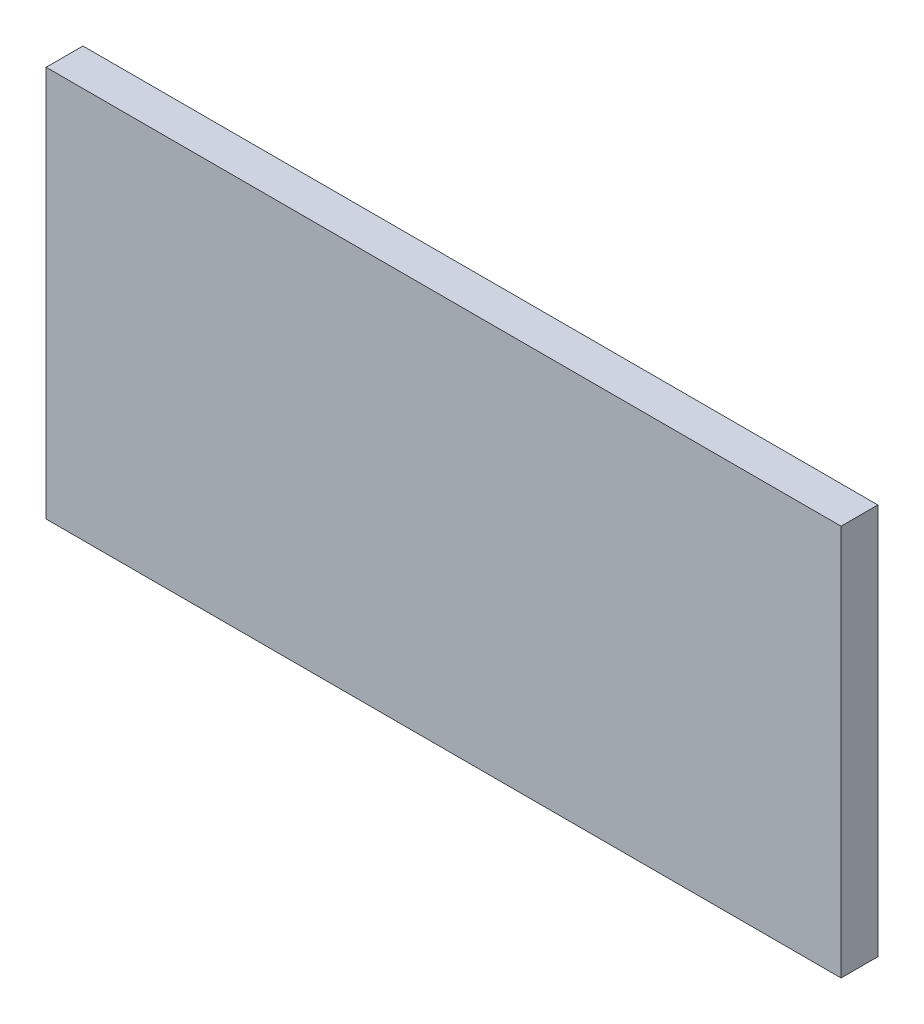
ISO-10303-21;
HEADER;
FILE_DESCRIPTION(('STEP AP214'),'2;1');
FILE_NAME('part.step','',(''),(''),'','','');
FILE_SCHEMA(('AUTOMOTIVE_DESIGN { 1 0 10303 214 1 1 1 1 }'));
ENDSEC;
DATA;
#1=APPLICATION_CONTEXT('core data for automotive mechanical design processes');
#2=APPLICATION_PROTOCOL_DEFINITION('international standard','automotive_design',2000,#1);
#3=PRODUCT_CONTEXT('',#1,'mechanical');
#4=PRODUCT('Part','Part','',(#3));
#5=PRODUCT_RELATED_PRODUCT_CATEGORY('part','',(#4));
#6=PRODUCT_DEFINITION_FORMATION('','',#4);
#7=PRODUCT_DEFINITION_CONTEXT('part definition',#1,'design');
#8=PRODUCT_DEFINITION('design','',#6,#7);
#9=PRODUCT_DEFINITION_SHAPE('','',#8);
#10=(LENGTH_UNIT() NAMED_UNIT(*) SI_UNIT(.MILLI.,.METRE.));
#11=(NAMED_UNIT(*) PLANE_ANGLE_UNIT() SI_UNIT($,.RADIAN.));
#12=(NAMED_UNIT(*) SI_UNIT($,.STERADIAN.) SOLID_ANGLE_UNIT());
#13=UNCERTAINTY_MEASURE_WITH_UNIT(LENGTH_MEASURE(1.E-05),#10,'distance_accuracy_value','');
#14=(GEOMETRIC_REPRESENTATION_CONTEXT(3) GLOBAL_UNCERTAINTY_ASSIGNED_CONTEXT((#13)) GLOBAL_UNIT_ASSIGNED_CONTEXT((#10,
#11,#12)) REPRESENTATION_CONTEXT('',''));
#15=CARTESIAN_POINT('',(0.,0.,0.));
#16=DIRECTION('',(0.,0.,1.));
#17=DIRECTION('',(1.,0.,0.));
#18=AXIS2_PLACEMENT_3D('',#15,#16,#17);
#19=CARTESIAN_POINT('',(-107.98835786802,-53.1530456852792,10.));
#20=DIRECTION('',(1.,0.,0.));
#21=DIRECTION('',(0.,0.,-1.));
#22=AXIS2_PLACEMENT_3D('',#19,#20,#21);
#23=PLANE('',#22);
#24=DIRECTION('',(0.,-1.,0.));
#25=VECTOR('',#24,1.);
#26=CARTESIAN_POINT('',(-107.98835786802,-53.1530456852792,0.));
#27=LINE('',#26,#25);
#28=CARTESIAN_POINT('',(-107.98835786802,53.1530456852792,0.));
#29=VERTEX_POINT('',#28);
#30=CARTESIAN_POINT('',(-107.98835786802,-53.1530456852792,0.));
#31=VERTEX_POINT('',#30);
#32=EDGE_CURVE('E96',#29,#31,#27,.T.);
#33=ORIENTED_EDGE('',*,*,#32,.T.);
#34=DIRECTION('',(0.,0.,-1.));
#35=VECTOR('',#34,1.);
#36=CARTESIAN_POINT('',(-107.98835786802,-53.1530456852792,10.));
#37=LINE('',#36,#35);
#38=CARTESIAN_POINT('',(-107.98835786802,-53.1530456852792,10.));
#39=VERTEX_POINT('',#38);
#40=EDGE_CURVE('E11',#39,#31,#37,.T.);
#41=ORIENTED_EDGE('',*,*,#40,.F.);
#42=DIRECTION('',(0.,-1.,0.));
#43=VECTOR('',#42,1.);
#44=CARTESIAN_POINT('',(-107.98835786802,-53.1530456852792,10.));
#45=LINE('',#44,#43);
#46=CARTESIAN_POINT('',(-107.98835786802,53.1530456852792,10.));
#47=VERTEX_POINT('',#46);
#48=EDGE_CURVE('E84',#47,#39,#45,.T.);
#49=ORIENTED_EDGE('',*,*,#48,.F.);
#50=DIRECTION('',(0.,0.,-1.));
#51=VECTOR('',#50,1.);
#52=CARTESIAN_POINT('',(-107.98835786802,53.1530456852792,10.));
#53=LINE('',#52,#51);
#54=EDGE_CURVE('E92',#47,#29,#53,.T.);
#55=ORIENTED_EDGE('',*,*,#54,.T.);
#56=EDGE_LOOP('',(#33,#41,#49,#55));
#57=FACE_BOUND('',#56,.T.);
#58=ADVANCED_FACE('F33',(#57),#23,.F.);
#59=CARTESIAN_POINT('',(107.98835786802,-53.1530456852792,10.));
#60=DIRECTION('',(0.,1.,0.));
#61=DIRECTION('',(0.,0.,1.));
#62=AXIS2_PLACEMENT_3D('',#59,#60,#61);
#63=PLANE('',#62);
#64=DIRECTION('',(1.,0.,0.));
#65=VECTOR('',#64,1.);
#66=CARTESIAN_POINT('',(107.98835786802,-53.1530456852792,0.));
#67=LINE('',#66,#65);
#68=CARTESIAN_POINT('',(107.98835786802,-53.1530456852792,0.));
#69=VERTEX_POINT('',#68);
#70=EDGE_CURVE('E88',#31,#69,#67,.T.);
#71=ORIENTED_EDGE('',*,*,#70,.T.);
#72=DIRECTION('',(0.,0.,-1.));
#73=VECTOR('',#72,1.);
#74=CARTESIAN_POINT('',(107.98835786802,-53.1530456852792,10.));
#75=LINE('',#74,#73);
#76=CARTESIAN_POINT('',(107.98835786802,-53.1530456852792,10.));
#77=VERTEX_POINT('',#76);
#78=EDGE_CURVE('E41',#77,#69,#75,.T.);
#79=ORIENTED_EDGE('',*,*,#78,.F.);
#80=DIRECTION('',(1.,0.,0.));
#81=VECTOR('',#80,1.);
#82=CARTESIAN_POINT('',(107.98835786802,-53.1530456852792,10.));
#83=LINE('',#82,#81);
#84=EDGE_CURVE('E79',#39,#77,#83,.T.);
#85=ORIENTED_EDGE('',*,*,#84,.F.);
#86=ORIENTED_EDGE('',*,*,#40,.T.);
#87=EDGE_LOOP('',(#71,#79,#85,#86));
#88=FACE_BOUND('',#87,.T.);
#89=ADVANCED_FACE('F87',(#88),#63,.F.);
#90=CARTESIAN_POINT('',(107.98835786802,-53.1530456852792,10.));
#91=DIRECTION('',(-1.,0.,0.));
#92=DIRECTION('',(0.,0.,1.));
#93=AXIS2_PLACEMENT_3D('',#90,#91,#92);
#94=PLANE('',#93);
#95=DIRECTION('',(0.,1.,0.));
#96=VECTOR('',#95,1.);
#97=CARTESIAN_POINT('',(107.98835786802,-53.1530456852792,0.));
#98=LINE('',#97,#96);
#99=CARTESIAN_POINT('',(107.98835786802,53.1530456852792,0.));
#100=VERTEX_POINT('',#99);
#101=EDGE_CURVE('E66',#69,#100,#98,.T.);
#102=ORIENTED_EDGE('',*,*,#101,.T.);
#103=DIRECTION('',(0.,0.,-1.));
#104=VECTOR('',#103,1.);
#105=CARTESIAN_POINT('',(107.98835786802,53.1530456852792,10.));
#106=LINE('',#105,#104);
#107=CARTESIAN_POINT('',(107.98835786802,53.1530456852792,10.));
#108=VERTEX_POINT('',#107);
#109=EDGE_CURVE('E89',#108,#100,#106,.T.);
#110=ORIENTED_EDGE('',*,*,#109,.F.);
#111=DIRECTION('',(0.,1.,0.));
#112=VECTOR('',#111,1.);
#113=CARTESIAN_POINT('',(107.98835786802,-53.1530456852792,10.));
#114=LINE('',#113,#112);
#115=EDGE_CURVE('E82',#77,#108,#114,.T.);
#116=ORIENTED_EDGE('',*,*,#115,.F.);
#117=ORIENTED_EDGE('',*,*,#78,.T.);
#118=EDGE_LOOP('',(#102,#110,#116,#117));
#119=FACE_BOUND('',#118,.T.);
#120=ADVANCED_FACE('F90',(#119),#94,.F.);
#121=CARTESIAN_POINT('',(107.98835786802,53.1530456852792,10.));
#122=DIRECTION('',(0.,-1.,0.));
#123=DIRECTION('',(0.,0.,-1.));
#124=AXIS2_PLACEMENT_3D('',#121,#122,#123);
#125=PLANE('',#124);
#126=DIRECTION('',(-1.,0.,0.));
#127=VECTOR('',#126,1.);
#128=CARTESIAN_POINT('',(107.98835786802,53.1530456852792,0.));
#129=LINE('',#128,#127);
#130=EDGE_CURVE('E72',#100,#29,#129,.T.);
#131=ORIENTED_EDGE('',*,*,#130,.T.);
#132=ORIENTED_EDGE('',*,*,#54,.F.);
#133=DIRECTION('',(-1.,0.,0.));
#134=VECTOR('',#133,1.);
#135=CARTESIAN_POINT('',(107.98835786802,53.1530456852792,10.));
#136=LINE('',#135,#134);
#137=EDGE_CURVE('E49',#108,#47,#136,.T.);
#138=ORIENTED_EDGE('',*,*,#137,.F.);
#139=ORIENTED_EDGE('',*,*,#109,.T.);
#140=EDGE_LOOP('',(#131,#132,#138,#139));
#141=FACE_BOUND('',#140,.T.);
#142=ADVANCED_FACE('F103',(#141),#125,.F.);
#143=CARTESIAN_POINT('',(0.,0.,10.));
#144=DIRECTION('',(0.,0.,1.));
#145=DIRECTION('',(1.,0.,0.));
#146=AXIS2_PLACEMENT_3D('',#143,#144,#145);
#147=PLANE('',#146);
#148=ORIENTED_EDGE('',*,*,#48,.T.);
#149=ORIENTED_EDGE('',*,*,#84,.T.);
#150=ORIENTED_EDGE('',*,*,#115,.T.);
#151=ORIENTED_EDGE('',*,*,#137,.T.);
#152=EDGE_LOOP('',(#148,#149,#150,#151));
#153=FACE_BOUND('',#152,.T.);
#154=ADVANCED_FACE('F80',(#153),#147,.T.);
#155=CARTESIAN_POINT('',(0.,0.,0.));
#156=DIRECTION('',(0.,0.,1.));
#157=DIRECTION('',(1.,0.,0.));
#158=AXIS2_PLACEMENT_3D('',#155,#156,#157);
#159=PLANE('',#158);
#160=ORIENTED_EDGE('',*,*,#32,.F.);
#161=ORIENTED_EDGE('',*,*,#130,.F.);
#162=ORIENTED_EDGE('',*,*,#101,.F.);
#163=ORIENTED_EDGE('',*,*,#70,.F.);
#164=EDGE_LOOP('',(#160,#161,#162,#163));
#165=FACE_BOUND('',#164,.T.);
#166=ADVANCED_FACE('F106',(#165),#159,.F.);
#167=CLOSED_SHELL('',(#58,#89,#120,#142,#154,#166));
#168=MANIFOLD_SOLID_BREP('B2',#167);
#169=ADVANCED_BREP_SHAPE_REPRESENTATION('',(#18,#168),#14);
#170=SHAPE_DEFINITION_REPRESENTATION(#9,#169);
ENDSEC;
END-ISO-10303-21;
